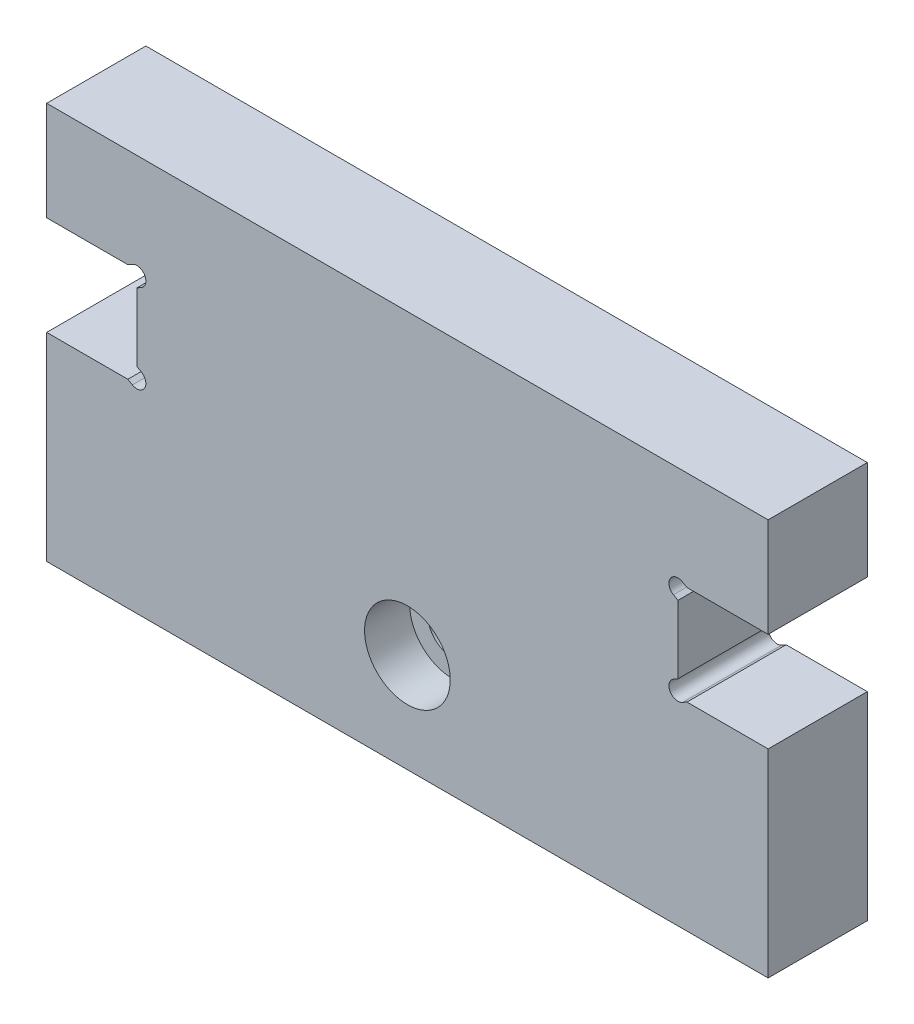
ISO-10303-21;
HEADER;
FILE_DESCRIPTION(('STEP AP214'),'2;1');
FILE_NAME('part.step','',(''),(''),'','','');
FILE_SCHEMA(('AUTOMOTIVE_DESIGN { 1 0 10303 214 1 1 1 1 }'));
ENDSEC;
DATA;
#1=APPLICATION_CONTEXT('core data for automotive mechanical design processes');
#2=APPLICATION_PROTOCOL_DEFINITION('international standard','automotive_design',2000,#1);
#3=PRODUCT_CONTEXT('',#1,'mechanical');
#4=PRODUCT('Part','Part','',(#3));
#5=PRODUCT_RELATED_PRODUCT_CATEGORY('part','',(#4));
#6=PRODUCT_DEFINITION_FORMATION('','',#4);
#7=PRODUCT_DEFINITION_CONTEXT('part definition',#1,'design');
#8=PRODUCT_DEFINITION('design','',#6,#7);
#9=PRODUCT_DEFINITION_SHAPE('','',#8);
#10=(LENGTH_UNIT() NAMED_UNIT(*) SI_UNIT(.MILLI.,.METRE.));
#11=(NAMED_UNIT(*) PLANE_ANGLE_UNIT() SI_UNIT($,.RADIAN.));
#12=(NAMED_UNIT(*) SI_UNIT($,.STERADIAN.) SOLID_ANGLE_UNIT());
#13=UNCERTAINTY_MEASURE_WITH_UNIT(LENGTH_MEASURE(1.E-05),#10,'distance_accuracy_value','');
#14=(GEOMETRIC_REPRESENTATION_CONTEXT(3) GLOBAL_UNCERTAINTY_ASSIGNED_CONTEXT((#13)) GLOBAL_UNIT_ASSIGNED_CONTEXT((#10,
#11,#12)) REPRESENTATION_CONTEXT('',''));
#15=CARTESIAN_POINT('',(0.,0.,0.));
#16=DIRECTION('',(0.,0.,1.));
#17=DIRECTION('',(1.,0.,0.));
#18=AXIS2_PLACEMENT_3D('',#15,#16,#17);
#19=CARTESIAN_POINT('',(0.,33.,11.));
#20=DIRECTION('',(-1.,0.,0.));
#21=DIRECTION('',(0.,0.,1.));
#22=AXIS2_PLACEMENT_3D('',#19,#20,#21);
#23=PLANE('',#22);
#24=DIRECTION('',(0.,1.,0.));
#25=VECTOR('',#24,1.);
#26=CARTESIAN_POINT('',(0.,33.,0.));
#27=LINE('',#26,#25);
#28=CARTESIAN_POINT('',(0.,33.,0.));
#29=VERTEX_POINT('',#28);
#30=CARTESIAN_POINT('',(0.,44.,0.));
#31=VERTEX_POINT('',#30);
#32=EDGE_CURVE('E231',#29,#31,#27,.T.);
#33=ORIENTED_EDGE('',*,*,#32,.F.);
#34=DIRECTION('',(0.,0.,-1.));
#35=VECTOR('',#34,1.);
#36=CARTESIAN_POINT('',(0.,33.,11.));
#37=LINE('',#36,#35);
#38=CARTESIAN_POINT('',(0.,33.,11.));
#39=VERTEX_POINT('',#38);
#40=EDGE_CURVE('E11',#39,#29,#37,.T.);
#41=ORIENTED_EDGE('',*,*,#40,.F.);
#42=DIRECTION('',(0.,1.,0.));
#43=VECTOR('',#42,1.);
#44=CARTESIAN_POINT('',(0.,33.,11.));
#45=LINE('',#44,#43);
#46=CARTESIAN_POINT('',(0.,44.,11.));
#47=VERTEX_POINT('',#46);
#48=EDGE_CURVE('E299',#39,#47,#45,.T.);
#49=ORIENTED_EDGE('',*,*,#48,.T.);
#50=DIRECTION('',(0.,0.,-1.));
#51=VECTOR('',#50,1.);
#52=CARTESIAN_POINT('',(0.,44.,11.));
#53=LINE('',#52,#51);
#54=EDGE_CURVE('E42',#47,#31,#53,.T.);
#55=ORIENTED_EDGE('',*,*,#54,.T.);
#56=EDGE_LOOP('',(#33,#41,#49,#55));
#57=FACE_BOUND('',#56,.T.);
#58=ADVANCED_FACE('F41',(#57),#23,.T.);
#59=CARTESIAN_POINT('',(0.,33.,11.));
#60=DIRECTION('',(0.,1.,0.));
#61=DIRECTION('',(0.,0.,1.));
#62=AXIS2_PLACEMENT_3D('',#59,#60,#61);
#63=PLANE('',#62);
#64=DIRECTION('',(1.,0.,0.));
#65=VECTOR('',#64,1.);
#66=CARTESIAN_POINT('',(0.,33.,0.));
#67=LINE('',#66,#65);
#68=CARTESIAN_POINT('',(9.,33.,0.));
#69=VERTEX_POINT('',#68);
#70=EDGE_CURVE('E133',#29,#69,#67,.T.);
#71=ORIENTED_EDGE('',*,*,#70,.T.);
#72=DIRECTION('',(0.,0.,-1.));
#73=VECTOR('',#72,1.);
#74=CARTESIAN_POINT('',(9.,33.,11.));
#75=LINE('',#74,#73);
#76=CARTESIAN_POINT('',(9.,33.,11.));
#77=VERTEX_POINT('',#76);
#78=EDGE_CURVE('E49',#77,#69,#75,.T.);
#79=ORIENTED_EDGE('',*,*,#78,.F.);
#80=DIRECTION('',(1.,0.,0.));
#81=VECTOR('',#80,1.);
#82=CARTESIAN_POINT('',(0.,33.,11.));
#83=LINE('',#82,#81);
#84=EDGE_CURVE('E213',#39,#77,#83,.T.);
#85=ORIENTED_EDGE('',*,*,#84,.F.);
#86=ORIENTED_EDGE('',*,*,#40,.T.);
#87=EDGE_LOOP('',(#71,#79,#85,#86));
#88=FACE_BOUND('',#87,.T.);
#89=ADVANCED_FACE('F448',(#88),#63,.F.);
#90=CARTESIAN_POINT('',(9.,33.,11.));
#91=DIRECTION('',(-0.499999999999994,0.866025403784442,0.));
#92=DIRECTION('',(-0.866025403784442,-0.499999999999994,0.));
#93=AXIS2_PLACEMENT_3D('',#90,#91,#92);
#94=PLANE('',#93);
#95=DIRECTION('',(0.866025403784442,0.499999999999994,0.));
#96=VECTOR('',#95,1.);
#97=CARTESIAN_POINT('',(9.,33.,0.));
#98=LINE('',#97,#96);
#99=CARTESIAN_POINT('',(9.50000000000001,33.2886751345948,0.));
#100=VERTEX_POINT('',#99);
#101=EDGE_CURVE('E219',#69,#100,#98,.T.);
#102=ORIENTED_EDGE('',*,*,#101,.T.);
#103=DIRECTION('',(0.,0.,-1.));
#104=VECTOR('',#103,1.);
#105=CARTESIAN_POINT('',(9.50000000000001,33.2886751345948,11.));
#106=LINE('',#105,#104);
#107=CARTESIAN_POINT('',(9.50000000000001,33.2886751345948,11.));
#108=VERTEX_POINT('',#107);
#109=EDGE_CURVE('E220',#108,#100,#106,.T.);
#110=ORIENTED_EDGE('',*,*,#109,.F.);
#111=DIRECTION('',(0.866025403784442,0.499999999999994,0.));
#112=VECTOR('',#111,1.);
#113=CARTESIAN_POINT('',(9.,33.,11.));
#114=LINE('',#113,#112);
#115=EDGE_CURVE('E206',#77,#108,#114,.T.);
#116=ORIENTED_EDGE('',*,*,#115,.F.);
#117=ORIENTED_EDGE('',*,*,#78,.T.);
#118=EDGE_LOOP('',(#102,#110,#116,#117));
#119=FACE_BOUND('',#118,.T.);
#120=ADVANCED_FACE('F217',(#119),#94,.F.);
#121=CARTESIAN_POINT('',(10.,32.4226497308104,11.));
#122=DIRECTION('',(0.,0.,-1.));
#123=DIRECTION('',(-1.,0.,0.));
#124=AXIS2_PLACEMENT_3D('',#121,#122,#123);
#125=CYLINDRICAL_SURFACE('',#124,0.999999999999999);
#126=CARTESIAN_POINT('',(10.,32.4226497308104,0.));
#127=DIRECTION('',(0.,0.,-1.));
#128=DIRECTION('',(-1.,0.,0.));
#129=AXIS2_PLACEMENT_3D('',#126,#127,#128);
#130=CIRCLE('',#129,0.999999999999999);
#131=CARTESIAN_POINT('',(10.4999999999998,31.5566243270258,0.));
#132=VERTEX_POINT('',#131);
#133=EDGE_CURVE('E293',#100,#132,#130,.T.);
#134=ORIENTED_EDGE('',*,*,#133,.T.);
#135=DIRECTION('',(0.,0.,-1.));
#136=VECTOR('',#135,1.);
#137=CARTESIAN_POINT('',(10.4999999999998,31.5566243270258,11.));
#138=LINE('',#137,#136);
#139=CARTESIAN_POINT('',(10.4999999999998,31.5566243270258,11.));
#140=VERTEX_POINT('',#139);
#141=EDGE_CURVE('E224',#140,#132,#138,.T.);
#142=ORIENTED_EDGE('',*,*,#141,.F.);
#143=CARTESIAN_POINT('',(10.,32.4226497308104,11.));
#144=DIRECTION('',(0.,0.,-1.));
#145=DIRECTION('',(-1.,0.,0.));
#146=AXIS2_PLACEMENT_3D('',#143,#144,#145);
#147=CIRCLE('',#146,0.999999999999999);
#148=EDGE_CURVE('E211',#108,#140,#147,.T.);
#149=ORIENTED_EDGE('',*,*,#148,.F.);
#150=ORIENTED_EDGE('',*,*,#109,.T.);
#151=EDGE_LOOP('',(#134,#142,#149,#150));
#152=FACE_BOUND('',#151,.T.);
#153=ADVANCED_FACE('F223',(#152),#125,.F.);
#154=CARTESIAN_POINT('',(10.4999999999998,31.5566243270258,11.));
#155=DIRECTION('',(0.500000000000008,-0.866025403784434,0.));
#156=DIRECTION('',(0.866025403784434,0.500000000000008,0.));
#157=AXIS2_PLACEMENT_3D('',#154,#155,#156);
#158=PLANE('',#157);
#159=DIRECTION('',(-0.866025403784434,-0.500000000000008,0.));
#160=VECTOR('',#159,1.);
#161=CARTESIAN_POINT('',(10.4999999999998,31.5566243270258,0.));
#162=LINE('',#161,#160);
#163=CARTESIAN_POINT('',(10.,31.2679491924311,0.));
#164=VERTEX_POINT('',#163);
#165=EDGE_CURVE('E291',#132,#164,#162,.T.);
#166=ORIENTED_EDGE('',*,*,#165,.T.);
#167=DIRECTION('',(0.,0.,-1.));
#168=VECTOR('',#167,1.);
#169=CARTESIAN_POINT('',(10.,31.2679491924311,11.));
#170=LINE('',#169,#168);
#171=CARTESIAN_POINT('',(10.,31.2679491924311,11.));
#172=VERTEX_POINT('',#171);
#173=EDGE_CURVE('E304',#172,#164,#170,.T.);
#174=ORIENTED_EDGE('',*,*,#173,.F.);
#175=DIRECTION('',(-0.866025403784434,-0.500000000000008,0.));
#176=VECTOR('',#175,1.);
#177=CARTESIAN_POINT('',(10.4999999999998,31.5566243270258,11.));
#178=LINE('',#177,#176);
#179=EDGE_CURVE('E229',#140,#172,#178,.T.);
#180=ORIENTED_EDGE('',*,*,#179,.F.);
#181=ORIENTED_EDGE('',*,*,#141,.T.);
#182=EDGE_LOOP('',(#166,#174,#180,#181));
#183=FACE_BOUND('',#182,.T.);
#184=ADVANCED_FACE('F348',(#183),#158,.F.);
#185=CARTESIAN_POINT('',(10.,31.2679491924311,11.));
#186=DIRECTION('',(1.,0.,0.));
#187=DIRECTION('',(0.,0.,-1.));
#188=AXIS2_PLACEMENT_3D('',#185,#186,#187);
#189=PLANE('',#188);
#190=DIRECTION('',(0.,-1.,0.));
#191=VECTOR('',#190,1.);
#192=CARTESIAN_POINT('',(10.,31.2679491924311,0.));
#193=LINE('',#192,#191);
#194=CARTESIAN_POINT('',(10.,23.7320508075689,0.));
#195=VERTEX_POINT('',#194);
#196=EDGE_CURVE('E286',#164,#195,#193,.T.);
#197=ORIENTED_EDGE('',*,*,#196,.T.);
#198=DIRECTION('',(0.,0.,-1.));
#199=VECTOR('',#198,1.);
#200=CARTESIAN_POINT('',(10.,23.7320508075689,11.));
#201=LINE('',#200,#199);
#202=CARTESIAN_POINT('',(10.,23.7320508075689,11.));
#203=VERTEX_POINT('',#202);
#204=EDGE_CURVE('E301',#203,#195,#201,.T.);
#205=ORIENTED_EDGE('',*,*,#204,.F.);
#206=DIRECTION('',(0.,-1.,0.));
#207=VECTOR('',#206,1.);
#208=CARTESIAN_POINT('',(10.,31.2679491924311,11.));
#209=LINE('',#208,#207);
#210=EDGE_CURVE('E230',#172,#203,#209,.T.);
#211=ORIENTED_EDGE('',*,*,#210,.F.);
#212=ORIENTED_EDGE('',*,*,#173,.T.);
#213=EDGE_LOOP('',(#197,#205,#211,#212));
#214=FACE_BOUND('',#213,.T.);
#215=ADVANCED_FACE('F356',(#214),#189,.F.);
#216=CARTESIAN_POINT('',(10.4999999999998,23.4433756729742,11.));
#217=DIRECTION('',(-0.500000000000006,-0.866025403784435,0.));
#218=DIRECTION('',(0.866025403784435,-0.500000000000006,0.));
#219=AXIS2_PLACEMENT_3D('',#216,#217,#218);
#220=PLANE('',#219);
#221=DIRECTION('',(-0.866025403784435,0.500000000000006,0.));
#222=VECTOR('',#221,1.);
#223=CARTESIAN_POINT('',(10.4999999999998,23.4433756729742,0.));
#224=LINE('',#223,#222);
#225=CARTESIAN_POINT('',(10.4999999999998,23.4433756729742,0.));
#226=VERTEX_POINT('',#225);
#227=EDGE_CURVE('E289',#226,#195,#224,.T.);
#228=ORIENTED_EDGE('',*,*,#227,.F.);
#229=DIRECTION('',(0.,0.,-1.));
#230=VECTOR('',#229,1.);
#231=CARTESIAN_POINT('',(10.4999999999998,23.4433756729742,11.));
#232=LINE('',#231,#230);
#233=CARTESIAN_POINT('',(10.4999999999998,23.4433756729742,11.));
#234=VERTEX_POINT('',#233);
#235=EDGE_CURVE('E307',#234,#226,#232,.T.);
#236=ORIENTED_EDGE('',*,*,#235,.F.);
#237=DIRECTION('',(-0.866025403784435,0.500000000000006,0.));
#238=VECTOR('',#237,1.);
#239=CARTESIAN_POINT('',(10.4999999999998,23.4433756729742,11.));
#240=LINE('',#239,#238);
#241=EDGE_CURVE('E359',#234,#203,#240,.T.);
#242=ORIENTED_EDGE('',*,*,#241,.T.);
#243=ORIENTED_EDGE('',*,*,#204,.T.);
#244=EDGE_LOOP('',(#228,#236,#242,#243));
#245=FACE_BOUND('',#244,.T.);
#246=ADVANCED_FACE('F361',(#245),#220,.T.);
#247=CARTESIAN_POINT('',(10.,22.5773502691896,11.));
#248=DIRECTION('',(0.,0.,-1.));
#249=DIRECTION('',(-1.,0.,0.));
#250=AXIS2_PLACEMENT_3D('',#247,#248,#249);
#251=CYLINDRICAL_SURFACE('',#250,1.);
#252=CARTESIAN_POINT('',(10.,22.5773502691896,0.));
#253=DIRECTION('',(0.,0.,1.));
#254=DIRECTION('',(1.,0.,0.));
#255=AXIS2_PLACEMENT_3D('',#252,#253,#254);
#256=CIRCLE('',#255,1.);
#257=CARTESIAN_POINT('',(9.50000000000001,21.7113248654052,0.));
#258=VERTEX_POINT('',#257);
#259=EDGE_CURVE('E283',#258,#226,#256,.T.);
#260=ORIENTED_EDGE('',*,*,#259,.F.);
#261=DIRECTION('',(0.,0.,-1.));
#262=VECTOR('',#261,1.);
#263=CARTESIAN_POINT('',(9.50000000000001,21.7113248654052,11.));
#264=LINE('',#263,#262);
#265=CARTESIAN_POINT('',(9.50000000000001,21.7113248654052,11.));
#266=VERTEX_POINT('',#265);
#267=EDGE_CURVE('E310',#266,#258,#264,.T.);
#268=ORIENTED_EDGE('',*,*,#267,.F.);
#269=CARTESIAN_POINT('',(10.,22.5773502691896,11.));
#270=DIRECTION('',(0.,0.,1.));
#271=DIRECTION('',(1.,0.,0.));
#272=AXIS2_PLACEMENT_3D('',#269,#270,#271);
#273=CIRCLE('',#272,1.);
#274=EDGE_CURVE('E365',#266,#234,#273,.T.);
#275=ORIENTED_EDGE('',*,*,#274,.T.);
#276=ORIENTED_EDGE('',*,*,#235,.T.);
#277=EDGE_LOOP('',(#260,#268,#275,#276));
#278=FACE_BOUND('',#277,.T.);
#279=ADVANCED_FACE('F469',(#278),#251,.F.);
#280=CARTESIAN_POINT('',(9.,22.,11.));
#281=DIRECTION('',(0.499999999999993,0.866025403784443,0.));
#282=DIRECTION('',(-0.866025403784443,0.499999999999993,0.));
#283=AXIS2_PLACEMENT_3D('',#280,#281,#282);
#284=PLANE('',#283);
#285=DIRECTION('',(0.866025403784443,-0.499999999999993,0.));
#286=VECTOR('',#285,1.);
#287=CARTESIAN_POINT('',(9.,22.,0.));
#288=LINE('',#287,#286);
#289=CARTESIAN_POINT('',(9.,22.,0.));
#290=VERTEX_POINT('',#289);
#291=EDGE_CURVE('E281',#290,#258,#288,.T.);
#292=ORIENTED_EDGE('',*,*,#291,.F.);
#293=DIRECTION('',(0.,0.,-1.));
#294=VECTOR('',#293,1.);
#295=CARTESIAN_POINT('',(9.,22.,11.));
#296=LINE('',#295,#294);
#297=CARTESIAN_POINT('',(9.,22.,11.));
#298=VERTEX_POINT('',#297);
#299=EDGE_CURVE('E313',#298,#290,#296,.T.);
#300=ORIENTED_EDGE('',*,*,#299,.F.);
#301=DIRECTION('',(0.866025403784443,-0.499999999999993,0.));
#302=VECTOR('',#301,1.);
#303=CARTESIAN_POINT('',(9.,22.,11.));
#304=LINE('',#303,#302);
#305=EDGE_CURVE('E368',#298,#266,#304,.T.);
#306=ORIENTED_EDGE('',*,*,#305,.T.);
#307=ORIENTED_EDGE('',*,*,#267,.T.);
#308=EDGE_LOOP('',(#292,#300,#306,#307));
#309=FACE_BOUND('',#308,.T.);
#310=ADVANCED_FACE('F466',(#309),#284,.T.);
#311=CARTESIAN_POINT('',(9.,22.,11.));
#312=DIRECTION('',(0.,-1.,0.));
#313=DIRECTION('',(0.,0.,-1.));
#314=AXIS2_PLACEMENT_3D('',#311,#312,#313);
#315=PLANE('',#314);
#316=DIRECTION('',(-1.,0.,0.));
#317=VECTOR('',#316,1.);
#318=CARTESIAN_POINT('',(9.,22.,0.));
#319=LINE('',#318,#317);
#320=CARTESIAN_POINT('',(0.,22.,0.));
#321=VERTEX_POINT('',#320);
#322=EDGE_CURVE('E279',#290,#321,#319,.T.);
#323=ORIENTED_EDGE('',*,*,#322,.T.);
#324=DIRECTION('',(0.,0.,-1.));
#325=VECTOR('',#324,1.);
#326=CARTESIAN_POINT('',(0.,22.,11.));
#327=LINE('',#326,#325);
#328=CARTESIAN_POINT('',(0.,22.,11.));
#329=VERTEX_POINT('',#328);
#330=EDGE_CURVE('E311',#329,#321,#327,.T.);
#331=ORIENTED_EDGE('',*,*,#330,.F.);
#332=DIRECTION('',(-1.,0.,0.));
#333=VECTOR('',#332,1.);
#334=CARTESIAN_POINT('',(9.,22.,11.));
#335=LINE('',#334,#333);
#336=EDGE_CURVE('E371',#298,#329,#335,.T.);
#337=ORIENTED_EDGE('',*,*,#336,.F.);
#338=ORIENTED_EDGE('',*,*,#299,.T.);
#339=EDGE_LOOP('',(#323,#331,#337,#338));
#340=FACE_BOUND('',#339,.T.);
#341=ADVANCED_FACE('F475',(#340),#315,.F.);
#342=CARTESIAN_POINT('',(0.,0.,11.));
#343=DIRECTION('',(-1.,0.,0.));
#344=DIRECTION('',(0.,-1.,0.));
#345=AXIS2_PLACEMENT_3D('',#342,#343,#344);
#346=PLANE('',#345);
#347=DIRECTION('',(0.,1.,0.));
#348=VECTOR('',#347,1.);
#349=CARTESIAN_POINT('',(0.,0.,0.));
#350=LINE('',#349,#348);
#351=CARTESIAN_POINT('',(0.,0.,0.));
#352=VERTEX_POINT('',#351);
#353=EDGE_CURVE('E274',#352,#321,#350,.T.);
#354=ORIENTED_EDGE('',*,*,#353,.F.);
#355=DIRECTION('',(0.,0.,-1.));
#356=VECTOR('',#355,1.);
#357=CARTESIAN_POINT('',(0.,0.,11.));
#358=LINE('',#357,#356);
#359=CARTESIAN_POINT('',(0.,0.,11.));
#360=VERTEX_POINT('',#359);
#361=EDGE_CURVE('E312',#360,#352,#358,.T.);
#362=ORIENTED_EDGE('',*,*,#361,.F.);
#363=DIRECTION('',(0.,1.,0.));
#364=VECTOR('',#363,1.);
#365=CARTESIAN_POINT('',(0.,0.,11.));
#366=LINE('',#365,#364);
#367=EDGE_CURVE('E373',#360,#329,#366,.T.);
#368=ORIENTED_EDGE('',*,*,#367,.T.);
#369=ORIENTED_EDGE('',*,*,#330,.T.);
#370=EDGE_LOOP('',(#354,#362,#368,#369));
#371=FACE_BOUND('',#370,.T.);
#372=ADVANCED_FACE('F476',(#371),#346,.T.);
#373=CARTESIAN_POINT('',(0.,0.,11.));
#374=DIRECTION('',(0.,1.,0.));
#375=DIRECTION('',(0.,0.,1.));
#376=AXIS2_PLACEMENT_3D('',#373,#374,#375);
#377=PLANE('',#376);
#378=DIRECTION('',(1.,0.,0.));
#379=VECTOR('',#378,1.);
#380=CARTESIAN_POINT('',(0.,0.,0.));
#381=LINE('',#380,#379);
#382=CARTESIAN_POINT('',(80.,0.,0.));
#383=VERTEX_POINT('',#382);
#384=EDGE_CURVE('E272',#352,#383,#381,.T.);
#385=ORIENTED_EDGE('',*,*,#384,.T.);
#386=DIRECTION('',(0.,0.,-1.));
#387=VECTOR('',#386,1.);
#388=CARTESIAN_POINT('',(80.,0.,11.));
#389=LINE('',#388,#387);
#390=CARTESIAN_POINT('',(80.,0.,11.));
#391=VERTEX_POINT('',#390);
#392=EDGE_CURVE('E320',#391,#383,#389,.T.);
#393=ORIENTED_EDGE('',*,*,#392,.F.);
#394=DIRECTION('',(1.,0.,0.));
#395=VECTOR('',#394,1.);
#396=CARTESIAN_POINT('',(0.,0.,11.));
#397=LINE('',#396,#395);
#398=EDGE_CURVE('E376',#360,#391,#397,.T.);
#399=ORIENTED_EDGE('',*,*,#398,.F.);
#400=ORIENTED_EDGE('',*,*,#361,.T.);
#401=EDGE_LOOP('',(#385,#393,#399,#400));
#402=FACE_BOUND('',#401,.T.);
#403=ADVANCED_FACE('F485',(#402),#377,.F.);
#404=CARTESIAN_POINT('',(80.,0.,11.));
#405=DIRECTION('',(-1.,0.,0.));
#406=DIRECTION('',(0.,0.,1.));
#407=AXIS2_PLACEMENT_3D('',#404,#405,#406);
#408=PLANE('',#407);
#409=DIRECTION('',(0.,1.,0.));
#410=VECTOR('',#409,1.);
#411=CARTESIAN_POINT('',(80.,0.,0.));
#412=LINE('',#411,#410);
#413=CARTESIAN_POINT('',(80.,22.,0.));
#414=VERTEX_POINT('',#413);
#415=EDGE_CURVE('E269',#383,#414,#412,.T.);
#416=ORIENTED_EDGE('',*,*,#415,.T.);
#417=DIRECTION('',(0.,0.,-1.));
#418=VECTOR('',#417,1.);
#419=CARTESIAN_POINT('',(80.,22.,11.));
#420=LINE('',#419,#418);
#421=CARTESIAN_POINT('',(80.,22.,11.));
#422=VERTEX_POINT('',#421);
#423=EDGE_CURVE('E319',#422,#414,#420,.T.);
#424=ORIENTED_EDGE('',*,*,#423,.F.);
#425=DIRECTION('',(0.,1.,0.));
#426=VECTOR('',#425,1.);
#427=CARTESIAN_POINT('',(80.,0.,11.));
#428=LINE('',#427,#426);
#429=EDGE_CURVE('E378',#391,#422,#428,.T.);
#430=ORIENTED_EDGE('',*,*,#429,.F.);
#431=ORIENTED_EDGE('',*,*,#392,.T.);
#432=EDGE_LOOP('',(#416,#424,#430,#431));
#433=FACE_BOUND('',#432,.T.);
#434=ADVANCED_FACE('F486',(#433),#408,.F.);
#435=CARTESIAN_POINT('',(71.,22.,11.));
#436=DIRECTION('',(0.,1.,0.));
#437=DIRECTION('',(0.,0.,1.));
#438=AXIS2_PLACEMENT_3D('',#435,#436,#437);
#439=PLANE('',#438);
#440=DIRECTION('',(1.,0.,0.));
#441=VECTOR('',#440,1.);
#442=CARTESIAN_POINT('',(71.,22.,0.));
#443=LINE('',#442,#441);
#444=CARTESIAN_POINT('',(71.,22.,0.));
#445=VERTEX_POINT('',#444);
#446=EDGE_CURVE('E270',#445,#414,#443,.T.);
#447=ORIENTED_EDGE('',*,*,#446,.F.);
#448=DIRECTION('',(0.,0.,-1.));
#449=VECTOR('',#448,1.);
#450=CARTESIAN_POINT('',(71.,22.,11.));
#451=LINE('',#450,#449);
#452=CARTESIAN_POINT('',(71.,22.,11.));
#453=VERTEX_POINT('',#452);
#454=EDGE_CURVE('E325',#453,#445,#451,.T.);
#455=ORIENTED_EDGE('',*,*,#454,.F.);
#456=DIRECTION('',(1.,0.,0.));
#457=VECTOR('',#456,1.);
#458=CARTESIAN_POINT('',(71.,22.,11.));
#459=LINE('',#458,#457);
#460=EDGE_CURVE('E379',#453,#422,#459,.T.);
#461=ORIENTED_EDGE('',*,*,#460,.T.);
#462=ORIENTED_EDGE('',*,*,#423,.T.);
#463=EDGE_LOOP('',(#447,#455,#461,#462));
#464=FACE_BOUND('',#463,.T.);
#465=ADVANCED_FACE('F489',(#464),#439,.T.);
#466=CARTESIAN_POINT('',(71.,22.,11.));
#467=DIRECTION('',(0.49999999999999,-0.866025403784445,0.));
#468=DIRECTION('',(0.866025403784445,0.49999999999999,0.));
#469=AXIS2_PLACEMENT_3D('',#466,#467,#468);
#470=PLANE('',#469);
#471=DIRECTION('',(-0.866025403784445,-0.49999999999999,0.));
#472=VECTOR('',#471,1.);
#473=CARTESIAN_POINT('',(71.,22.,0.));
#474=LINE('',#473,#472);
#475=CARTESIAN_POINT('',(70.5,21.7113248654052,0.));
#476=VERTEX_POINT('',#475);
#477=EDGE_CURVE('E264',#445,#476,#474,.T.);
#478=ORIENTED_EDGE('',*,*,#477,.T.);
#479=DIRECTION('',(0.,0.,-1.));
#480=VECTOR('',#479,1.);
#481=CARTESIAN_POINT('',(70.5,21.7113248654052,11.));
#482=LINE('',#481,#480);
#483=CARTESIAN_POINT('',(70.5,21.7113248654052,11.));
#484=VERTEX_POINT('',#483);
#485=EDGE_CURVE('E322',#484,#476,#482,.T.);
#486=ORIENTED_EDGE('',*,*,#485,.F.);
#487=DIRECTION('',(-0.866025403784445,-0.49999999999999,0.));
#488=VECTOR('',#487,1.);
#489=CARTESIAN_POINT('',(71.,22.,11.));
#490=LINE('',#489,#488);
#491=EDGE_CURVE('E382',#453,#484,#490,.T.);
#492=ORIENTED_EDGE('',*,*,#491,.F.);
#493=ORIENTED_EDGE('',*,*,#454,.T.);
#494=EDGE_LOOP('',(#478,#486,#492,#493));
#495=FACE_BOUND('',#494,.T.);
#496=ADVANCED_FACE('F493',(#495),#470,.F.);
#497=CARTESIAN_POINT('',(70.,22.5773502691896,11.));
#498=DIRECTION('',(0.,0.,-1.));
#499=DIRECTION('',(-1.,0.,0.));
#500=AXIS2_PLACEMENT_3D('',#497,#498,#499);
#501=CYLINDRICAL_SURFACE('',#500,1.);
#502=CARTESIAN_POINT('',(70.,22.5773502691896,0.));
#503=DIRECTION('',(0.,0.,-1.));
#504=DIRECTION('',(-1.,0.,0.));
#505=AXIS2_PLACEMENT_3D('',#502,#503,#504);
#506=CIRCLE('',#505,1.);
#507=CARTESIAN_POINT('',(69.5000000000002,23.4433756729742,0.));
#508=VERTEX_POINT('',#507);
#509=EDGE_CURVE('E263',#476,#508,#506,.T.);
#510=ORIENTED_EDGE('',*,*,#509,.T.);
#511=DIRECTION('',(0.,0.,-1.));
#512=VECTOR('',#511,1.);
#513=CARTESIAN_POINT('',(69.5000000000002,23.4433756729742,11.));
#514=LINE('',#513,#512);
#515=CARTESIAN_POINT('',(69.5000000000002,23.4433756729742,11.));
#516=VERTEX_POINT('',#515);
#517=EDGE_CURVE('E330',#516,#508,#514,.T.);
#518=ORIENTED_EDGE('',*,*,#517,.F.);
#519=CARTESIAN_POINT('',(70.,22.5773502691896,11.));
#520=DIRECTION('',(0.,0.,-1.));
#521=DIRECTION('',(-1.,0.,0.));
#522=AXIS2_PLACEMENT_3D('',#519,#520,#521);
#523=CIRCLE('',#522,1.);
#524=EDGE_CURVE('E384',#484,#516,#523,.T.);
#525=ORIENTED_EDGE('',*,*,#524,.F.);
#526=ORIENTED_EDGE('',*,*,#485,.T.);
#527=EDGE_LOOP('',(#510,#518,#525,#526));
#528=FACE_BOUND('',#527,.T.);
#529=ADVANCED_FACE('F499',(#528),#501,.F.);
#530=CARTESIAN_POINT('',(69.5000000000002,23.4433756729742,11.));
#531=DIRECTION('',(-0.5,0.866025403784439,0.));
#532=DIRECTION('',(-0.866025403784439,-0.5,0.));
#533=AXIS2_PLACEMENT_3D('',#530,#531,#532);
#534=PLANE('',#533);
#535=DIRECTION('',(0.866025403784439,0.5,0.));
#536=VECTOR('',#535,1.);
#537=CARTESIAN_POINT('',(69.5000000000002,23.4433756729742,0.));
#538=LINE('',#537,#536);
#539=CARTESIAN_POINT('',(70.,23.7320508075689,0.));
#540=VERTEX_POINT('',#539);
#541=EDGE_CURVE('E257',#508,#540,#538,.T.);
#542=ORIENTED_EDGE('',*,*,#541,.T.);
#543=DIRECTION('',(0.,0.,-1.));
#544=VECTOR('',#543,1.);
#545=CARTESIAN_POINT('',(70.,23.7320508075689,11.));
#546=LINE('',#545,#544);
#547=CARTESIAN_POINT('',(70.,23.7320508075689,11.));
#548=VERTEX_POINT('',#547);
#549=EDGE_CURVE('E329',#548,#540,#546,.T.);
#550=ORIENTED_EDGE('',*,*,#549,.F.);
#551=DIRECTION('',(0.866025403784439,0.5,0.));
#552=VECTOR('',#551,1.);
#553=CARTESIAN_POINT('',(69.5000000000002,23.4433756729742,11.));
#554=LINE('',#553,#552);
#555=EDGE_CURVE('E390',#516,#548,#554,.T.);
#556=ORIENTED_EDGE('',*,*,#555,.F.);
#557=ORIENTED_EDGE('',*,*,#517,.T.);
#558=EDGE_LOOP('',(#542,#550,#556,#557));
#559=FACE_BOUND('',#558,.T.);
#560=ADVANCED_FACE('F502',(#559),#534,.F.);
#561=CARTESIAN_POINT('',(70.,31.2679491924311,11.));
#562=DIRECTION('',(1.,0.,0.));
#563=DIRECTION('',(0.,0.,-1.));
#564=AXIS2_PLACEMENT_3D('',#561,#562,#563);
#565=PLANE('',#564);
#566=DIRECTION('',(0.,-1.,0.));
#567=VECTOR('',#566,1.);
#568=CARTESIAN_POINT('',(70.,31.2679491924311,0.));
#569=LINE('',#568,#567);
#570=CARTESIAN_POINT('',(70.,31.2679491924311,0.));
#571=VERTEX_POINT('',#570);
#572=EDGE_CURVE('E260',#571,#540,#569,.T.);
#573=ORIENTED_EDGE('',*,*,#572,.F.);
#574=DIRECTION('',(0.,0.,-1.));
#575=VECTOR('',#574,1.);
#576=CARTESIAN_POINT('',(70.,31.2679491924311,11.));
#577=LINE('',#576,#575);
#578=CARTESIAN_POINT('',(70.,31.2679491924311,11.));
#579=VERTEX_POINT('',#578);
#580=EDGE_CURVE('E335',#579,#571,#577,.T.);
#581=ORIENTED_EDGE('',*,*,#580,.F.);
#582=DIRECTION('',(0.,-1.,0.));
#583=VECTOR('',#582,1.);
#584=CARTESIAN_POINT('',(70.,31.2679491924311,11.));
#585=LINE('',#584,#583);
#586=EDGE_CURVE('E386',#579,#548,#585,.T.);
#587=ORIENTED_EDGE('',*,*,#586,.T.);
#588=ORIENTED_EDGE('',*,*,#549,.T.);
#589=EDGE_LOOP('',(#573,#581,#587,#588));
#590=FACE_BOUND('',#589,.T.);
#591=ADVANCED_FACE('F508',(#590),#565,.T.);
#592=CARTESIAN_POINT('',(69.5000000000002,31.5566243270258,11.));
#593=DIRECTION('',(0.5,0.866025403784439,0.));
#594=DIRECTION('',(-0.866025403784439,0.5,0.));
#595=AXIS2_PLACEMENT_3D('',#592,#593,#594);
#596=PLANE('',#595);
#597=DIRECTION('',(0.866025403784439,-0.5,0.));
#598=VECTOR('',#597,1.);
#599=CARTESIAN_POINT('',(69.5000000000002,31.5566243270258,0.));
#600=LINE('',#599,#598);
#601=CARTESIAN_POINT('',(69.5000000000002,31.5566243270258,0.));
#602=VERTEX_POINT('',#601);
#603=EDGE_CURVE('E255',#602,#571,#600,.T.);
#604=ORIENTED_EDGE('',*,*,#603,.F.);
#605=DIRECTION('',(0.,0.,-1.));
#606=VECTOR('',#605,1.);
#607=CARTESIAN_POINT('',(69.5000000000002,31.5566243270258,11.));
#608=LINE('',#607,#606);
#609=CARTESIAN_POINT('',(69.5000000000002,31.5566243270258,11.));
#610=VERTEX_POINT('',#609);
#611=EDGE_CURVE('E331',#610,#602,#608,.T.);
#612=ORIENTED_EDGE('',*,*,#611,.F.);
#613=DIRECTION('',(0.866025403784439,-0.5,0.));
#614=VECTOR('',#613,1.);
#615=CARTESIAN_POINT('',(69.5000000000002,31.5566243270258,11.));
#616=LINE('',#615,#614);
#617=EDGE_CURVE('E392',#610,#579,#616,.T.);
#618=ORIENTED_EDGE('',*,*,#617,.T.);
#619=ORIENTED_EDGE('',*,*,#580,.T.);
#620=EDGE_LOOP('',(#604,#612,#618,#619));
#621=FACE_BOUND('',#620,.T.);
#622=ADVANCED_FACE('F506',(#621),#596,.T.);
#623=CARTESIAN_POINT('',(70.,32.4226497308104,11.));
#624=DIRECTION('',(0.,0.,-1.));
#625=DIRECTION('',(-1.,0.,0.));
#626=AXIS2_PLACEMENT_3D('',#623,#624,#625);
#627=CYLINDRICAL_SURFACE('',#626,0.999999999999999);
#628=CARTESIAN_POINT('',(70.,32.4226497308104,0.));
#629=DIRECTION('',(0.,0.,1.));
#630=DIRECTION('',(1.,0.,0.));
#631=AXIS2_PLACEMENT_3D('',#628,#629,#630);
#632=CIRCLE('',#631,0.999999999999999);
#633=CARTESIAN_POINT('',(70.5,33.2886751345948,0.));
#634=VERTEX_POINT('',#633);
#635=EDGE_CURVE('E253',#634,#602,#632,.T.);
#636=ORIENTED_EDGE('',*,*,#635,.F.);
#637=DIRECTION('',(0.,0.,-1.));
#638=VECTOR('',#637,1.);
#639=CARTESIAN_POINT('',(70.5,33.2886751345948,11.));
#640=LINE('',#639,#638);
#641=CARTESIAN_POINT('',(70.5,33.2886751345948,11.));
#642=VERTEX_POINT('',#641);
#643=EDGE_CURVE('E336',#642,#634,#640,.T.);
#644=ORIENTED_EDGE('',*,*,#643,.F.);
#645=CARTESIAN_POINT('',(70.,32.4226497308104,11.));
#646=DIRECTION('',(0.,0.,1.));
#647=DIRECTION('',(1.,0.,0.));
#648=AXIS2_PLACEMENT_3D('',#645,#646,#647);
#649=CIRCLE('',#648,0.999999999999999);
#650=EDGE_CURVE('E395',#642,#610,#649,.T.);
#651=ORIENTED_EDGE('',*,*,#650,.T.);
#652=ORIENTED_EDGE('',*,*,#611,.T.);
#653=EDGE_LOOP('',(#636,#644,#651,#652));
#654=FACE_BOUND('',#653,.T.);
#655=ADVANCED_FACE('F514',(#654),#627,.F.);
#656=CARTESIAN_POINT('',(71.,33.,11.));
#657=DIRECTION('',(-0.499999999999985,-0.866025403784447,0.));
#658=DIRECTION('',(0.866025403784447,-0.499999999999985,0.));
#659=AXIS2_PLACEMENT_3D('',#656,#657,#658);
#660=PLANE('',#659);
#661=DIRECTION('',(-0.866025403784447,0.499999999999985,0.));
#662=VECTOR('',#661,1.);
#663=CARTESIAN_POINT('',(71.,33.,0.));
#664=LINE('',#663,#662);
#665=CARTESIAN_POINT('',(71.,33.,0.));
#666=VERTEX_POINT('',#665);
#667=EDGE_CURVE('E247',#666,#634,#664,.T.);
#668=ORIENTED_EDGE('',*,*,#667,.F.);
#669=DIRECTION('',(0.,0.,-1.));
#670=VECTOR('',#669,1.);
#671=CARTESIAN_POINT('',(71.,33.,11.));
#672=LINE('',#671,#670);
#673=CARTESIAN_POINT('',(71.,33.,11.));
#674=VERTEX_POINT('',#673);
#675=EDGE_CURVE('E339',#674,#666,#672,.T.);
#676=ORIENTED_EDGE('',*,*,#675,.F.);
#677=DIRECTION('',(-0.866025403784447,0.499999999999985,0.));
#678=VECTOR('',#677,1.);
#679=CARTESIAN_POINT('',(71.,33.,11.));
#680=LINE('',#679,#678);
#681=EDGE_CURVE('E397',#674,#642,#680,.T.);
#682=ORIENTED_EDGE('',*,*,#681,.T.);
#683=ORIENTED_EDGE('',*,*,#643,.T.);
#684=EDGE_LOOP('',(#668,#676,#682,#683));
#685=FACE_BOUND('',#684,.T.);
#686=ADVANCED_FACE('F519',(#685),#660,.T.);
#687=CARTESIAN_POINT('',(80.,33.,11.));
#688=DIRECTION('',(0.,-1.,0.));
#689=DIRECTION('',(0.,0.,-1.));
#690=AXIS2_PLACEMENT_3D('',#687,#688,#689);
#691=PLANE('',#690);
#692=DIRECTION('',(-1.,0.,0.));
#693=VECTOR('',#692,1.);
#694=CARTESIAN_POINT('',(80.,33.,0.));
#695=LINE('',#694,#693);
#696=CARTESIAN_POINT('',(80.,33.,0.));
#697=VERTEX_POINT('',#696);
#698=EDGE_CURVE('E245',#697,#666,#695,.T.);
#699=ORIENTED_EDGE('',*,*,#698,.F.);
#700=DIRECTION('',(0.,0.,-1.));
#701=VECTOR('',#700,1.);
#702=CARTESIAN_POINT('',(80.,33.,11.));
#703=LINE('',#702,#701);
#704=CARTESIAN_POINT('',(80.,33.,11.));
#705=VERTEX_POINT('',#704);
#706=EDGE_CURVE('E340',#705,#697,#703,.T.);
#707=ORIENTED_EDGE('',*,*,#706,.F.);
#708=DIRECTION('',(-1.,0.,0.));
#709=VECTOR('',#708,1.);
#710=CARTESIAN_POINT('',(80.,33.,11.));
#711=LINE('',#710,#709);
#712=EDGE_CURVE('E402',#705,#674,#711,.T.);
#713=ORIENTED_EDGE('',*,*,#712,.T.);
#714=ORIENTED_EDGE('',*,*,#675,.T.);
#715=EDGE_LOOP('',(#699,#707,#713,#714));
#716=FACE_BOUND('',#715,.T.);
#717=ADVANCED_FACE('F524',(#716),#691,.T.);
#718=CARTESIAN_POINT('',(80.,33.,11.));
#719=DIRECTION('',(-1.,0.,0.));
#720=DIRECTION('',(0.,0.,1.));
#721=AXIS2_PLACEMENT_3D('',#718,#719,#720);
#722=PLANE('',#721);
#723=DIRECTION('',(0.,1.,0.));
#724=VECTOR('',#723,1.);
#725=CARTESIAN_POINT('',(80.,33.,0.));
#726=LINE('',#725,#724);
#727=CARTESIAN_POINT('',(80.,44.,0.));
#728=VERTEX_POINT('',#727);
#729=EDGE_CURVE('E242',#697,#728,#726,.T.);
#730=ORIENTED_EDGE('',*,*,#729,.T.);
#731=DIRECTION('',(0.,0.,-1.));
#732=VECTOR('',#731,1.);
#733=CARTESIAN_POINT('',(80.,44.,11.));
#734=LINE('',#733,#732);
#735=CARTESIAN_POINT('',(80.,44.,11.));
#736=VERTEX_POINT('',#735);
#737=EDGE_CURVE('E343',#736,#728,#734,.T.);
#738=ORIENTED_EDGE('',*,*,#737,.F.);
#739=DIRECTION('',(0.,1.,0.));
#740=VECTOR('',#739,1.);
#741=CARTESIAN_POINT('',(80.,33.,11.));
#742=LINE('',#741,#740);
#743=EDGE_CURVE('E404',#705,#736,#742,.T.);
#744=ORIENTED_EDGE('',*,*,#743,.F.);
#745=ORIENTED_EDGE('',*,*,#706,.T.);
#746=EDGE_LOOP('',(#730,#738,#744,#745));
#747=FACE_BOUND('',#746,.T.);
#748=ADVANCED_FACE('F447',(#747),#722,.F.);
#749=CARTESIAN_POINT('',(0.,44.,11.));
#750=DIRECTION('',(0.,1.,0.));
#751=DIRECTION('',(0.,0.,1.));
#752=AXIS2_PLACEMENT_3D('',#749,#750,#751);
#753=PLANE('',#752);
#754=DIRECTION('',(1.,0.,0.));
#755=VECTOR('',#754,1.);
#756=CARTESIAN_POINT('',(0.,44.,0.));
#757=LINE('',#756,#755);
#758=EDGE_CURVE('E236',#31,#728,#757,.T.);
#759=ORIENTED_EDGE('',*,*,#758,.F.);
#760=ORIENTED_EDGE('',*,*,#54,.F.);
#761=DIRECTION('',(1.,0.,0.));
#762=VECTOR('',#761,1.);
#763=CARTESIAN_POINT('',(0.,44.,11.));
#764=LINE('',#763,#762);
#765=EDGE_CURVE('E406',#47,#736,#764,.T.);
#766=ORIENTED_EDGE('',*,*,#765,.T.);
#767=ORIENTED_EDGE('',*,*,#737,.T.);
#768=EDGE_LOOP('',(#759,#760,#766,#767));
#769=FACE_BOUND('',#768,.T.);
#770=ADVANCED_FACE('F342',(#769),#753,.T.);
#771=CARTESIAN_POINT('',(70.,32.4226497308104,11.));
#772=DIRECTION('',(0.,0.,1.));
#773=DIRECTION('',(1.,0.,0.));
#774=AXIS2_PLACEMENT_3D('',#771,#772,#773);
#775=PLANE('',#774);
#776=CARTESIAN_POINT('',(40.,11.,11.));
#777=DIRECTION('',(0.,0.,1.));
#778=DIRECTION('',(1.,0.,0.));
#779=AXIS2_PLACEMENT_3D('',#776,#777,#778);
#780=CIRCLE('',#779,4.75);
#781=CARTESIAN_POINT('',(44.75,11.,11.));
#782=VERTEX_POINT('',#781);
#783=EDGE_CURVE('E408',#782,#782,#780,.T.);
#784=ORIENTED_EDGE('',*,*,#783,.F.);
#785=EDGE_LOOP('',(#784));
#786=FACE_BOUND('',#785,.T.);
#787=ORIENTED_EDGE('',*,*,#48,.F.);
#788=ORIENTED_EDGE('',*,*,#84,.T.);
#789=ORIENTED_EDGE('',*,*,#115,.T.);
#790=ORIENTED_EDGE('',*,*,#148,.T.);
#791=ORIENTED_EDGE('',*,*,#179,.T.);
#792=ORIENTED_EDGE('',*,*,#210,.T.);
#793=ORIENTED_EDGE('',*,*,#241,.F.);
#794=ORIENTED_EDGE('',*,*,#274,.F.);
#795=ORIENTED_EDGE('',*,*,#305,.F.);
#796=ORIENTED_EDGE('',*,*,#336,.T.);
#797=ORIENTED_EDGE('',*,*,#367,.F.);
#798=ORIENTED_EDGE('',*,*,#398,.T.);
#799=ORIENTED_EDGE('',*,*,#429,.T.);
#800=ORIENTED_EDGE('',*,*,#460,.F.);
#801=ORIENTED_EDGE('',*,*,#491,.T.);
#802=ORIENTED_EDGE('',*,*,#524,.T.);
#803=ORIENTED_EDGE('',*,*,#555,.T.);
#804=ORIENTED_EDGE('',*,*,#586,.F.);
#805=ORIENTED_EDGE('',*,*,#617,.F.);
#806=ORIENTED_EDGE('',*,*,#650,.F.);
#807=ORIENTED_EDGE('',*,*,#681,.F.);
#808=ORIENTED_EDGE('',*,*,#712,.F.);
#809=ORIENTED_EDGE('',*,*,#743,.T.);
#810=ORIENTED_EDGE('',*,*,#765,.F.);
#811=EDGE_LOOP('',(#787,#788,#789,#790,#791,#792,#793,#794,#795,#796,#797,#798,#799,#800,#801,
#802,#803,#804,#805,#806,#807,#808,#809,#810));
#812=FACE_BOUND('',#811,.T.);
#813=ADVANCED_FACE('F207',(#786,#812),#775,.T.);
#814=CARTESIAN_POINT('',(70.,32.4226497308104,0.));
#815=DIRECTION('',(0.,0.,1.));
#816=DIRECTION('',(1.,0.,0.));
#817=AXIS2_PLACEMENT_3D('',#814,#815,#816);
#818=PLANE('',#817);
#819=CARTESIAN_POINT('',(40.,11.,0.));
#820=DIRECTION('',(0.,0.,1.));
#821=DIRECTION('',(1.,0.,0.));
#822=AXIS2_PLACEMENT_3D('',#819,#820,#821);
#823=CIRCLE('',#822,2.75);
#824=CARTESIAN_POINT('',(42.75,11.,0.));
#825=VERTEX_POINT('',#824);
#826=EDGE_CURVE('E414',#825,#825,#823,.T.);
#827=ORIENTED_EDGE('',*,*,#826,.T.);
#828=EDGE_LOOP('',(#827));
#829=FACE_BOUND('',#828,.T.);
#830=ORIENTED_EDGE('',*,*,#32,.T.);
#831=ORIENTED_EDGE('',*,*,#758,.T.);
#832=ORIENTED_EDGE('',*,*,#729,.F.);
#833=ORIENTED_EDGE('',*,*,#698,.T.);
#834=ORIENTED_EDGE('',*,*,#667,.T.);
#835=ORIENTED_EDGE('',*,*,#635,.T.);
#836=ORIENTED_EDGE('',*,*,#603,.T.);
#837=ORIENTED_EDGE('',*,*,#572,.T.);
#838=ORIENTED_EDGE('',*,*,#541,.F.);
#839=ORIENTED_EDGE('',*,*,#509,.F.);
#840=ORIENTED_EDGE('',*,*,#477,.F.);
#841=ORIENTED_EDGE('',*,*,#446,.T.);
#842=ORIENTED_EDGE('',*,*,#415,.F.);
#843=ORIENTED_EDGE('',*,*,#384,.F.);
#844=ORIENTED_EDGE('',*,*,#353,.T.);
#845=ORIENTED_EDGE('',*,*,#322,.F.);
#846=ORIENTED_EDGE('',*,*,#291,.T.);
#847=ORIENTED_EDGE('',*,*,#259,.T.);
#848=ORIENTED_EDGE('',*,*,#227,.T.);
#849=ORIENTED_EDGE('',*,*,#196,.F.);
#850=ORIENTED_EDGE('',*,*,#165,.F.);
#851=ORIENTED_EDGE('',*,*,#133,.F.);
#852=ORIENTED_EDGE('',*,*,#101,.F.);
#853=ORIENTED_EDGE('',*,*,#70,.F.);
#854=EDGE_LOOP('',(#830,#831,#832,#833,#834,#835,#836,#837,#838,#839,#840,#841,#842,#843,#844,
#845,#846,#847,#848,#849,#850,#851,#852,#853));
#855=FACE_BOUND('',#854,.T.);
#856=ADVANCED_FACE('F347',(#829,#855),#818,.F.);
#857=CARTESIAN_POINT('',(40.,11.,6.));
#858=DIRECTION('',(0.,0.,1.));
#859=DIRECTION('',(1.,0.,0.));
#860=AXIS2_PLACEMENT_3D('',#857,#858,#859);
#861=CYLINDRICAL_SURFACE('',#860,4.75);
#862=CARTESIAN_POINT('',(40.,11.,6.));
#863=DIRECTION('',(0.,0.,1.));
#864=DIRECTION('',(1.,0.,0.));
#865=AXIS2_PLACEMENT_3D('',#862,#863,#864);
#866=CIRCLE('',#865,4.75);
#867=CARTESIAN_POINT('',(44.75,11.,6.));
#868=VERTEX_POINT('',#867);
#869=EDGE_CURVE('E239',#868,#868,#866,.T.);
#870=ORIENTED_EDGE('',*,*,#869,.F.);
#871=EDGE_LOOP('',(#870));
#872=FACE_BOUND('',#871,.T.);
#873=ORIENTED_EDGE('',*,*,#783,.T.);
#874=EDGE_LOOP('',(#873));
#875=FACE_BOUND('',#874,.T.);
#876=ADVANCED_FACE('F431',(#872,#875),#861,.F.);
#877=CARTESIAN_POINT('',(40.,11.,6.));
#878=DIRECTION('',(0.,0.,1.));
#879=DIRECTION('',(1.,0.,0.));
#880=AXIS2_PLACEMENT_3D('',#877,#878,#879);
#881=PLANE('',#880);
#882=CARTESIAN_POINT('',(40.,11.,6.));
#883=DIRECTION('',(0.,0.,1.));
#884=DIRECTION('',(1.,0.,0.));
#885=AXIS2_PLACEMENT_3D('',#882,#883,#884);
#886=CIRCLE('',#885,2.75);
#887=CARTESIAN_POINT('',(42.75,11.,6.));
#888=VERTEX_POINT('',#887);
#889=EDGE_CURVE('E411',#888,#888,#886,.T.);
#890=ORIENTED_EDGE('',*,*,#889,.F.);
#891=EDGE_LOOP('',(#890));
#892=FACE_BOUND('',#891,.T.);
#893=ORIENTED_EDGE('',*,*,#869,.T.);
#894=EDGE_LOOP('',(#893));
#895=FACE_BOUND('',#894,.T.);
#896=ADVANCED_FACE('F422',(#892,#895),#881,.T.);
#897=CARTESIAN_POINT('',(40.,11.,0.));
#898=DIRECTION('',(0.,0.,1.));
#899=DIRECTION('',(1.,0.,0.));
#900=AXIS2_PLACEMENT_3D('',#897,#898,#899);
#901=CYLINDRICAL_SURFACE('',#900,2.75);
#902=ORIENTED_EDGE('',*,*,#826,.F.);
#903=EDGE_LOOP('',(#902));
#904=FACE_BOUND('',#903,.T.);
#905=ORIENTED_EDGE('',*,*,#889,.T.);
#906=EDGE_LOOP('',(#905));
#907=FACE_BOUND('',#906,.T.);
#908=ADVANCED_FACE('F425',(#904,#907),#901,.F.);
#909=CLOSED_SHELL('',(#58,#89,#120,#153,#184,#215,#246,#279,#310,#341,#372,#403,#434,#465,#496,
#529,#560,#591,#622,#655,#686,#717,#748,#770,#813,#856,#876,#896,#908));
#910=MANIFOLD_SOLID_BREP('B2',#909);
#911=ADVANCED_BREP_SHAPE_REPRESENTATION('',(#18,#910),#14);
#912=SHAPE_DEFINITION_REPRESENTATION(#9,#911);
ENDSEC;
END-ISO-10303-21;
